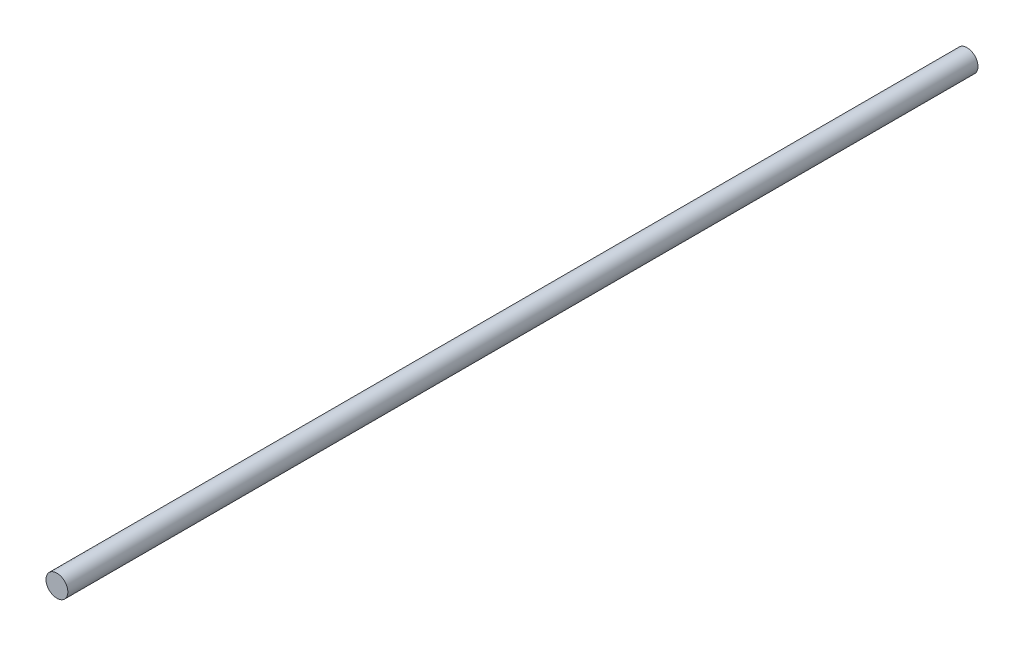
ISO-10303-21;
HEADER;
FILE_DESCRIPTION(('STEP AP214'),'2;1');
FILE_NAME('part.step','',(''),(''),'','','');
FILE_SCHEMA(('AUTOMOTIVE_DESIGN { 1 0 10303 214 1 1 1 1 }'));
ENDSEC;
DATA;
#1=APPLICATION_CONTEXT('core data for automotive mechanical design processes');
#2=APPLICATION_PROTOCOL_DEFINITION('international standard','automotive_design',2000,#1);
#3=PRODUCT_CONTEXT('',#1,'mechanical');
#4=PRODUCT('Part','Part','',(#3));
#5=PRODUCT_RELATED_PRODUCT_CATEGORY('part','',(#4));
#6=PRODUCT_DEFINITION_FORMATION('','',#4);
#7=PRODUCT_DEFINITION_CONTEXT('part definition',#1,'design');
#8=PRODUCT_DEFINITION('design','',#6,#7);
#9=PRODUCT_DEFINITION_SHAPE('','',#8);
#10=(LENGTH_UNIT() NAMED_UNIT(*) SI_UNIT(.MILLI.,.METRE.));
#11=(NAMED_UNIT(*) PLANE_ANGLE_UNIT() SI_UNIT($,.RADIAN.));
#12=(NAMED_UNIT(*) SI_UNIT($,.STERADIAN.) SOLID_ANGLE_UNIT());
#13=UNCERTAINTY_MEASURE_WITH_UNIT(LENGTH_MEASURE(1.E-05),#10,'distance_accuracy_value','');
#14=(GEOMETRIC_REPRESENTATION_CONTEXT(3) GLOBAL_UNCERTAINTY_ASSIGNED_CONTEXT((#13)) GLOBAL_UNIT_ASSIGNED_CONTEXT((#10,
#11,#12)) REPRESENTATION_CONTEXT('',''));
#15=CARTESIAN_POINT('',(0.,0.,0.));
#16=DIRECTION('',(0.,0.,1.));
#17=DIRECTION('',(1.,0.,0.));
#18=AXIS2_PLACEMENT_3D('',#15,#16,#17);
#19=CARTESIAN_POINT('',(0.,0.,75.));
#20=DIRECTION('',(0.,0.,-1.));
#21=DIRECTION('',(-1.,0.,0.));
#22=AXIS2_PLACEMENT_3D('',#19,#20,#21);
#23=CYLINDRICAL_SURFACE('',#22,0.9);
#24=CARTESIAN_POINT('',(0.,0.,75.));
#25=DIRECTION('',(0.,0.,1.));
#26=DIRECTION('',(1.,0.,0.));
#27=AXIS2_PLACEMENT_3D('',#24,#25,#26);
#28=CIRCLE('',#27,0.9);
#29=CARTESIAN_POINT('',(0.9,0.,75.));
#30=VERTEX_POINT('',#29);
#31=EDGE_CURVE('E10',#30,#30,#28,.T.);
#32=ORIENTED_EDGE('',*,*,#31,.F.);
#33=EDGE_LOOP('',(#32));
#34=FACE_BOUND('',#33,.T.);
#35=CARTESIAN_POINT('',(0.,0.,0.));
#36=DIRECTION('',(0.,0.,1.));
#37=DIRECTION('',(1.,0.,0.));
#38=AXIS2_PLACEMENT_3D('',#35,#36,#37);
#39=CIRCLE('',#38,0.9);
#40=CARTESIAN_POINT('',(0.9,0.,0.));
#41=VERTEX_POINT('',#40);
#42=EDGE_CURVE('E46',#41,#41,#39,.T.);
#43=ORIENTED_EDGE('',*,*,#42,.T.);
#44=EDGE_LOOP('',(#43));
#45=FACE_BOUND('',#44,.T.);
#46=ADVANCED_FACE('F43',(#34,#45),#23,.T.);
#47=CARTESIAN_POINT('',(0.,0.,75.));
#48=DIRECTION('',(0.,0.,1.));
#49=DIRECTION('',(1.,0.,0.));
#50=AXIS2_PLACEMENT_3D('',#47,#48,#49);
#51=PLANE('',#50);
#52=ORIENTED_EDGE('',*,*,#31,.T.);
#53=EDGE_LOOP('',(#52));
#54=FACE_BOUND('',#53,.T.);
#55=ADVANCED_FACE('F60',(#54),#51,.T.);
#56=CARTESIAN_POINT('',(0.,0.,0.));
#57=DIRECTION('',(0.,0.,1.));
#58=DIRECTION('',(1.,0.,0.));
#59=AXIS2_PLACEMENT_3D('',#56,#57,#58);
#60=PLANE('',#59);
#61=ORIENTED_EDGE('',*,*,#42,.F.);
#62=EDGE_LOOP('',(#61));
#63=FACE_BOUND('',#62,.T.);
#64=ADVANCED_FACE('F58',(#63),#60,.F.);
#65=CLOSED_SHELL('',(#46,#55,#64));
#66=MANIFOLD_SOLID_BREP('B2',#65);
#67=ADVANCED_BREP_SHAPE_REPRESENTATION('',(#18,#66),#14);
#68=SHAPE_DEFINITION_REPRESENTATION(#9,#67);
ENDSEC;
END-ISO-10303-21;
